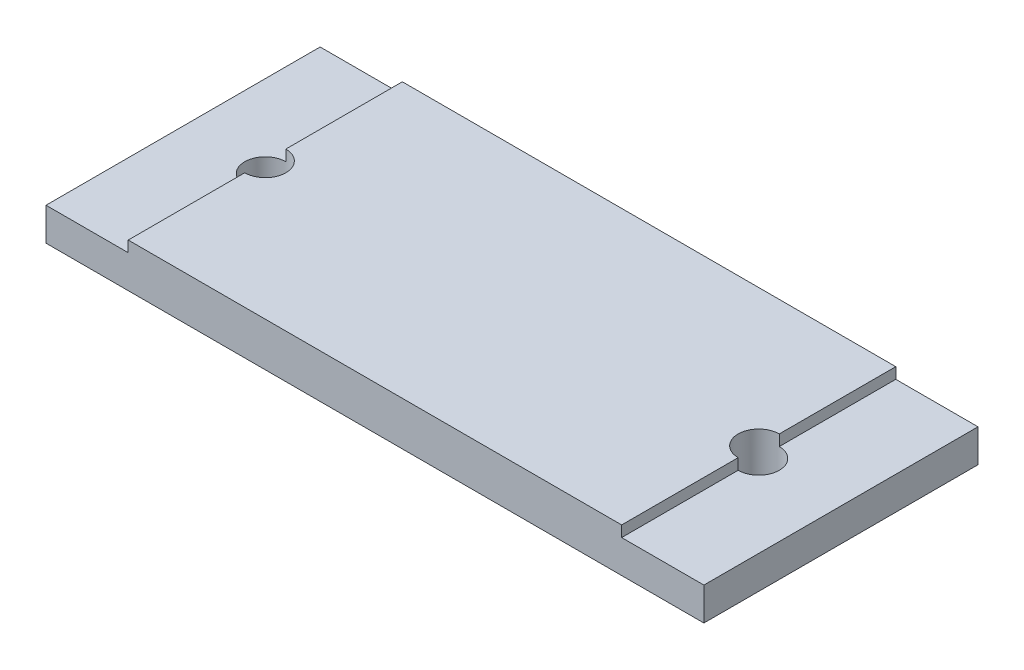
ISO-10303-21;
HEADER;
FILE_DESCRIPTION(('STEP AP214'),'2;1');
FILE_NAME('part.step','',(''),(''),'','','');
FILE_SCHEMA(('AUTOMOTIVE_DESIGN { 1 0 10303 214 1 1 1 1 }'));
ENDSEC;
DATA;
#1=APPLICATION_CONTEXT('core data for automotive mechanical design processes');
#2=APPLICATION_PROTOCOL_DEFINITION('international standard','automotive_design',2000,#1);
#3=PRODUCT_CONTEXT('',#1,'mechanical');
#4=PRODUCT('Part','Part','',(#3));
#5=PRODUCT_RELATED_PRODUCT_CATEGORY('part','',(#4));
#6=PRODUCT_DEFINITION_FORMATION('','',#4);
#7=PRODUCT_DEFINITION_CONTEXT('part definition',#1,'design');
#8=PRODUCT_DEFINITION('design','',#6,#7);
#9=PRODUCT_DEFINITION_SHAPE('','',#8);
#10=(LENGTH_UNIT() NAMED_UNIT(*) SI_UNIT(.MILLI.,.METRE.));
#11=(NAMED_UNIT(*) PLANE_ANGLE_UNIT() SI_UNIT($,.RADIAN.));
#12=(NAMED_UNIT(*) SI_UNIT($,.STERADIAN.) SOLID_ANGLE_UNIT());
#13=UNCERTAINTY_MEASURE_WITH_UNIT(LENGTH_MEASURE(1.E-05),#10,'distance_accuracy_value','');
#14=(GEOMETRIC_REPRESENTATION_CONTEXT(3) GLOBAL_UNCERTAINTY_ASSIGNED_CONTEXT((#13)) GLOBAL_UNIT_ASSIGNED_CONTEXT((#10,
#11,#12)) REPRESENTATION_CONTEXT('',''));
#15=CARTESIAN_POINT('',(0.,0.,0.));
#16=DIRECTION('',(0.,0.,1.));
#17=DIRECTION('',(1.,0.,0.));
#18=AXIS2_PLACEMENT_3D('',#15,#16,#17);
#19=CARTESIAN_POINT('',(0.,15.24,0.));
#20=DIRECTION('',(0.,1.,0.));
#21=DIRECTION('',(0.,0.,1.));
#22=AXIS2_PLACEMENT_3D('',#19,#20,#21);
#23=PLANE('',#22);
#24=DIRECTION('',(0.,0.,1.));
#25=VECTOR('',#24,1.);
#26=CARTESIAN_POINT('',(38.1,15.24,0.));
#27=LINE('',#26,#25);
#28=CARTESIAN_POINT('',(38.1,15.24,0.));
#29=VERTEX_POINT('',#28);
#30=CARTESIAN_POINT('',(38.1,15.24,53.975));
#31=VERTEX_POINT('',#30);
#32=EDGE_CURVE('E163',#29,#31,#27,.T.);
#33=ORIENTED_EDGE('',*,*,#32,.F.);
#34=DIRECTION('',(-1.,0.,0.));
#35=VECTOR('',#34,1.);
#36=CARTESIAN_POINT('',(0.,15.24,0.));
#37=LINE('',#36,#35);
#38=CARTESIAN_POINT('',(0.,15.24,0.));
#39=VERTEX_POINT('',#38);
#40=EDGE_CURVE('E198',#29,#39,#37,.T.);
#41=ORIENTED_EDGE('',*,*,#40,.T.);
#42=DIRECTION('',(0.,0.,1.));
#43=VECTOR('',#42,1.);
#44=CARTESIAN_POINT('',(0.,15.24,0.));
#45=LINE('',#44,#43);
#46=CARTESIAN_POINT('',(0.,15.24,127.));
#47=VERTEX_POINT('',#46);
#48=EDGE_CURVE('E186',#39,#47,#45,.T.);
#49=ORIENTED_EDGE('',*,*,#48,.T.);
#50=DIRECTION('',(1.,0.,0.));
#51=VECTOR('',#50,1.);
#52=CARTESIAN_POINT('',(0.,15.24,127.));
#53=LINE('',#52,#51);
#54=CARTESIAN_POINT('',(38.1,15.24,127.));
#55=VERTEX_POINT('',#54);
#56=EDGE_CURVE('E192',#47,#55,#53,.T.);
#57=ORIENTED_EDGE('',*,*,#56,.T.);
#58=DIRECTION('',(0.,0.,1.));
#59=VECTOR('',#58,1.);
#60=CARTESIAN_POINT('',(38.1,15.24,73.025));
#61=LINE('',#60,#59);
#62=CARTESIAN_POINT('',(38.1,15.24,73.025));
#63=VERTEX_POINT('',#62);
#64=EDGE_CURVE('E299',#63,#55,#61,.T.);
#65=ORIENTED_EDGE('',*,*,#64,.F.);
#66=CARTESIAN_POINT('',(38.1,15.24,63.5));
#67=DIRECTION('',(0.,1.,0.));
#68=DIRECTION('',(0.,0.,1.));
#69=AXIS2_PLACEMENT_3D('',#66,#67,#68);
#70=CIRCLE('',#69,9.525);
#71=EDGE_CURVE('E179',#31,#63,#70,.T.);
#72=ORIENTED_EDGE('',*,*,#71,.F.);
#73=EDGE_LOOP('',(#33,#41,#49,#57,#65,#72));
#74=FACE_BOUND('',#73,.T.);
#75=ADVANCED_FACE('F49',(#74),#23,.T.);
#76=DIRECTION('',(0.,0.,-1.));
#77=VECTOR('',#76,1.);
#78=CARTESIAN_POINT('',(266.7,15.24,0.));
#79=LINE('',#78,#77);
#80=CARTESIAN_POINT('',(266.7,15.24,53.975));
#81=VERTEX_POINT('',#80);
#82=CARTESIAN_POINT('',(266.7,15.24,0.));
#83=VERTEX_POINT('',#82);
#84=EDGE_CURVE('E65',#81,#83,#79,.T.);
#85=ORIENTED_EDGE('',*,*,#84,.F.);
#86=CARTESIAN_POINT('',(266.7,15.24,63.5));
#87=DIRECTION('',(0.,1.,0.));
#88=DIRECTION('',(0.,0.,1.));
#89=AXIS2_PLACEMENT_3D('',#86,#87,#88);
#90=CIRCLE('',#89,9.52500000000002);
#91=CARTESIAN_POINT('',(266.7,15.24,73.025));
#92=VERTEX_POINT('',#91);
#93=EDGE_CURVE('E69',#92,#81,#90,.T.);
#94=ORIENTED_EDGE('',*,*,#93,.F.);
#95=DIRECTION('',(0.,0.,-1.));
#96=VECTOR('',#95,1.);
#97=CARTESIAN_POINT('',(266.7,15.24,73.025));
#98=LINE('',#97,#96);
#99=CARTESIAN_POINT('',(266.7,15.24,127.));
#100=VERTEX_POINT('',#99);
#101=EDGE_CURVE('E263',#100,#92,#98,.T.);
#102=ORIENTED_EDGE('',*,*,#101,.F.);
#103=CARTESIAN_POINT('',(304.8,15.24,127.));
#104=VERTEX_POINT('',#103);
#105=EDGE_CURVE('E190',#100,#104,#53,.T.);
#106=ORIENTED_EDGE('',*,*,#105,.T.);
#107=DIRECTION('',(0.,0.,-1.));
#108=VECTOR('',#107,1.);
#109=CARTESIAN_POINT('',(304.8,15.24,0.));
#110=LINE('',#109,#108);
#111=CARTESIAN_POINT('',(304.8,15.24,0.));
#112=VERTEX_POINT('',#111);
#113=EDGE_CURVE('E195',#104,#112,#110,.T.);
#114=ORIENTED_EDGE('',*,*,#113,.T.);
#115=EDGE_CURVE('E199',#112,#83,#37,.T.);
#116=ORIENTED_EDGE('',*,*,#115,.T.);
#117=EDGE_LOOP('',(#85,#94,#102,#106,#114,#116));
#118=FACE_BOUND('',#117,.T.);
#119=ADVANCED_FACE('F262',(#118),#23,.T.);
#120=CARTESIAN_POINT('',(0.,0.,0.));
#121=DIRECTION('',(0.,1.,0.));
#122=DIRECTION('',(0.,0.,1.));
#123=AXIS2_PLACEMENT_3D('',#120,#121,#122);
#124=PLANE('',#123);
#125=DIRECTION('',(0.,0.,1.));
#126=VECTOR('',#125,1.);
#127=CARTESIAN_POINT('',(0.,0.,0.));
#128=LINE('',#127,#126);
#129=CARTESIAN_POINT('',(0.,0.,0.));
#130=VERTEX_POINT('',#129);
#131=CARTESIAN_POINT('',(0.,0.,127.));
#132=VERTEX_POINT('',#131);
#133=EDGE_CURVE('E182',#130,#132,#128,.T.);
#134=ORIENTED_EDGE('',*,*,#133,.F.);
#135=DIRECTION('',(-1.,0.,0.));
#136=VECTOR('',#135,1.);
#137=CARTESIAN_POINT('',(0.,0.,0.));
#138=LINE('',#137,#136);
#139=CARTESIAN_POINT('',(304.8,0.,0.));
#140=VERTEX_POINT('',#139);
#141=EDGE_CURVE('E191',#140,#130,#138,.T.);
#142=ORIENTED_EDGE('',*,*,#141,.F.);
#143=DIRECTION('',(0.,0.,-1.));
#144=VECTOR('',#143,1.);
#145=CARTESIAN_POINT('',(304.8,0.,0.));
#146=LINE('',#145,#144);
#147=CARTESIAN_POINT('',(304.8,0.,127.));
#148=VERTEX_POINT('',#147);
#149=EDGE_CURVE('E209',#148,#140,#146,.T.);
#150=ORIENTED_EDGE('',*,*,#149,.F.);
#151=DIRECTION('',(1.,0.,0.));
#152=VECTOR('',#151,1.);
#153=CARTESIAN_POINT('',(0.,0.,127.));
#154=LINE('',#153,#152);
#155=EDGE_CURVE('E206',#132,#148,#154,.T.);
#156=ORIENTED_EDGE('',*,*,#155,.F.);
#157=EDGE_LOOP('',(#134,#142,#150,#156));
#158=FACE_BOUND('',#157,.T.);
#159=CARTESIAN_POINT('',(38.1,0.,63.5));
#160=DIRECTION('',(0.,1.,0.));
#161=DIRECTION('',(0.,0.,1.));
#162=AXIS2_PLACEMENT_3D('',#159,#160,#161);
#163=CIRCLE('',#162,9.525);
#164=CARTESIAN_POINT('',(38.1,0.,73.025));
#165=VERTEX_POINT('',#164);
#166=EDGE_CURVE('E177',#165,#165,#163,.T.);
#167=ORIENTED_EDGE('',*,*,#166,.T.);
#168=EDGE_LOOP('',(#167));
#169=FACE_BOUND('',#168,.T.);
#170=CARTESIAN_POINT('',(266.7,0.,63.5));
#171=DIRECTION('',(0.,1.,0.));
#172=DIRECTION('',(0.,0.,1.));
#173=AXIS2_PLACEMENT_3D('',#170,#171,#172);
#174=CIRCLE('',#173,9.52500000000002);
#175=CARTESIAN_POINT('',(266.7,0.,73.025));
#176=VERTEX_POINT('',#175);
#177=EDGE_CURVE('E165',#176,#176,#174,.T.);
#178=ORIENTED_EDGE('',*,*,#177,.T.);
#179=EDGE_LOOP('',(#178));
#180=FACE_BOUND('',#179,.T.);
#181=ADVANCED_FACE('F234',(#158,#169,#180),#124,.F.);
#182=CARTESIAN_POINT('',(0.,15.24,0.));
#183=DIRECTION('',(1.,0.,0.));
#184=DIRECTION('',(0.,0.,-1.));
#185=AXIS2_PLACEMENT_3D('',#182,#183,#184);
#186=PLANE('',#185);
#187=ORIENTED_EDGE('',*,*,#133,.T.);
#188=DIRECTION('',(0.,-1.,0.));
#189=VECTOR('',#188,1.);
#190=CARTESIAN_POINT('',(0.,15.24,127.));
#191=LINE('',#190,#189);
#192=EDGE_CURVE('E11',#47,#132,#191,.T.);
#193=ORIENTED_EDGE('',*,*,#192,.F.);
#194=ORIENTED_EDGE('',*,*,#48,.F.);
#195=DIRECTION('',(0.,-1.,0.));
#196=VECTOR('',#195,1.);
#197=CARTESIAN_POINT('',(0.,15.24,0.));
#198=LINE('',#197,#196);
#199=EDGE_CURVE('E202',#39,#130,#198,.T.);
#200=ORIENTED_EDGE('',*,*,#199,.T.);
#201=EDGE_LOOP('',(#187,#193,#194,#200));
#202=FACE_BOUND('',#201,.T.);
#203=ADVANCED_FACE('F51',(#202),#186,.F.);
#204=CARTESIAN_POINT('',(0.,15.24,127.));
#205=DIRECTION('',(0.,0.,-1.));
#206=DIRECTION('',(-1.,0.,0.));
#207=AXIS2_PLACEMENT_3D('',#204,#205,#206);
#208=PLANE('',#207);
#209=ORIENTED_EDGE('',*,*,#155,.T.);
#210=DIRECTION('',(0.,-1.,0.));
#211=VECTOR('',#210,1.);
#212=CARTESIAN_POINT('',(304.8,15.24,127.));
#213=LINE('',#212,#211);
#214=EDGE_CURVE('E58',#104,#148,#213,.T.);
#215=ORIENTED_EDGE('',*,*,#214,.F.);
#216=ORIENTED_EDGE('',*,*,#105,.F.);
#217=DIRECTION('',(0.,-1.,0.));
#218=VECTOR('',#217,1.);
#219=CARTESIAN_POINT('',(266.7,20.32,127.));
#220=LINE('',#219,#218);
#221=CARTESIAN_POINT('',(266.7,20.32,127.));
#222=VERTEX_POINT('',#221);
#223=EDGE_CURVE('E268',#222,#100,#220,.T.);
#224=ORIENTED_EDGE('',*,*,#223,.F.);
#225=DIRECTION('',(1.,0.,0.));
#226=VECTOR('',#225,1.);
#227=CARTESIAN_POINT('',(38.1,20.32,127.));
#228=LINE('',#227,#226);
#229=CARTESIAN_POINT('',(38.1,20.32,127.));
#230=VERTEX_POINT('',#229);
#231=EDGE_CURVE('E314',#230,#222,#228,.T.);
#232=ORIENTED_EDGE('',*,*,#231,.F.);
#233=DIRECTION('',(0.,-1.,0.));
#234=VECTOR('',#233,1.);
#235=CARTESIAN_POINT('',(38.1,20.32,127.));
#236=LINE('',#235,#234);
#237=EDGE_CURVE('E172',#230,#55,#236,.T.);
#238=ORIENTED_EDGE('',*,*,#237,.T.);
#239=ORIENTED_EDGE('',*,*,#56,.F.);
#240=ORIENTED_EDGE('',*,*,#192,.T.);
#241=EDGE_LOOP('',(#209,#215,#216,#224,#232,#238,#239,#240));
#242=FACE_BOUND('',#241,.T.);
#243=ADVANCED_FACE('F266',(#242),#208,.F.);
#244=CARTESIAN_POINT('',(304.8,15.24,0.));
#245=DIRECTION('',(-1.,0.,0.));
#246=DIRECTION('',(0.,0.,1.));
#247=AXIS2_PLACEMENT_3D('',#244,#245,#246);
#248=PLANE('',#247);
#249=ORIENTED_EDGE('',*,*,#149,.T.);
#250=DIRECTION('',(0.,-1.,0.));
#251=VECTOR('',#250,1.);
#252=CARTESIAN_POINT('',(304.8,15.24,0.));
#253=LINE('',#252,#251);
#254=EDGE_CURVE('E217',#112,#140,#253,.T.);
#255=ORIENTED_EDGE('',*,*,#254,.F.);
#256=ORIENTED_EDGE('',*,*,#113,.F.);
#257=ORIENTED_EDGE('',*,*,#214,.T.);
#258=EDGE_LOOP('',(#249,#255,#256,#257));
#259=FACE_BOUND('',#258,.T.);
#260=ADVANCED_FACE('F227',(#259),#248,.F.);
#261=CARTESIAN_POINT('',(0.,15.24,0.));
#262=DIRECTION('',(0.,0.,1.));
#263=DIRECTION('',(1.,0.,0.));
#264=AXIS2_PLACEMENT_3D('',#261,#262,#263);
#265=PLANE('',#264);
#266=ORIENTED_EDGE('',*,*,#141,.T.);
#267=ORIENTED_EDGE('',*,*,#199,.F.);
#268=ORIENTED_EDGE('',*,*,#40,.F.);
#269=DIRECTION('',(0.,-1.,0.));
#270=VECTOR('',#269,1.);
#271=CARTESIAN_POINT('',(38.1,20.32,0.));
#272=LINE('',#271,#270);
#273=CARTESIAN_POINT('',(38.1,20.32,0.));
#274=VERTEX_POINT('',#273);
#275=EDGE_CURVE('E292',#274,#29,#272,.T.);
#276=ORIENTED_EDGE('',*,*,#275,.F.);
#277=DIRECTION('',(-1.,0.,0.));
#278=VECTOR('',#277,1.);
#279=CARTESIAN_POINT('',(38.1,20.32,0.));
#280=LINE('',#279,#278);
#281=CARTESIAN_POINT('',(266.7,20.32,0.));
#282=VERTEX_POINT('',#281);
#283=EDGE_CURVE('E156',#282,#274,#280,.T.);
#284=ORIENTED_EDGE('',*,*,#283,.F.);
#285=DIRECTION('',(0.,-1.,0.));
#286=VECTOR('',#285,1.);
#287=CARTESIAN_POINT('',(266.7,20.32,0.));
#288=LINE('',#287,#286);
#289=EDGE_CURVE('E288',#282,#83,#288,.T.);
#290=ORIENTED_EDGE('',*,*,#289,.T.);
#291=ORIENTED_EDGE('',*,*,#115,.F.);
#292=ORIENTED_EDGE('',*,*,#254,.T.);
#293=EDGE_LOOP('',(#266,#267,#268,#276,#284,#290,#291,#292));
#294=FACE_BOUND('',#293,.T.);
#295=ADVANCED_FACE('F238',(#294),#265,.F.);
#296=CARTESIAN_POINT('',(38.1,15.24,63.5));
#297=DIRECTION('',(0.,-1.,0.));
#298=DIRECTION('',(0.,0.,-1.));
#299=AXIS2_PLACEMENT_3D('',#296,#297,#298);
#300=CYLINDRICAL_SURFACE('',#299,9.525);
#301=ORIENTED_EDGE('',*,*,#71,.T.);
#302=DIRECTION('',(0.,-1.,0.));
#303=VECTOR('',#302,1.);
#304=CARTESIAN_POINT('',(38.1,20.32,73.025));
#305=LINE('',#304,#303);
#306=CARTESIAN_POINT('',(38.1,20.32,73.025));
#307=VERTEX_POINT('',#306);
#308=EDGE_CURVE('E146',#307,#63,#305,.T.);
#309=ORIENTED_EDGE('',*,*,#308,.F.);
#310=CARTESIAN_POINT('',(38.1,20.32,63.5));
#311=DIRECTION('',(0.,-1.,0.));
#312=DIRECTION('',(0.,0.,1.));
#313=AXIS2_PLACEMENT_3D('',#310,#311,#312);
#314=CIRCLE('',#313,9.52500000000001);
#315=CARTESIAN_POINT('',(38.1,20.32,53.975));
#316=VERTEX_POINT('',#315);
#317=EDGE_CURVE('E137',#316,#307,#314,.T.);
#318=ORIENTED_EDGE('',*,*,#317,.F.);
#319=DIRECTION('',(0.,-1.,0.));
#320=VECTOR('',#319,1.);
#321=CARTESIAN_POINT('',(38.1,20.32,53.975));
#322=LINE('',#321,#320);
#323=EDGE_CURVE('E143',#316,#31,#322,.T.);
#324=ORIENTED_EDGE('',*,*,#323,.T.);
#325=EDGE_LOOP('',(#301,#309,#318,#324));
#326=FACE_BOUND('',#325,.T.);
#327=ORIENTED_EDGE('',*,*,#166,.F.);
#328=EDGE_LOOP('',(#327));
#329=FACE_BOUND('',#328,.T.);
#330=ADVANCED_FACE('F140',(#326,#329),#300,.F.);
#331=CARTESIAN_POINT('',(266.7,15.24,63.5));
#332=DIRECTION('',(0.,-1.,0.));
#333=DIRECTION('',(0.,0.,-1.));
#334=AXIS2_PLACEMENT_3D('',#331,#332,#333);
#335=CYLINDRICAL_SURFACE('',#334,9.52500000000002);
#336=ORIENTED_EDGE('',*,*,#93,.T.);
#337=DIRECTION('',(0.,-1.,0.));
#338=VECTOR('',#337,1.);
#339=CARTESIAN_POINT('',(266.7,20.32,53.975));
#340=LINE('',#339,#338);
#341=CARTESIAN_POINT('',(266.7,20.32,53.975));
#342=VERTEX_POINT('',#341);
#343=EDGE_CURVE('E282',#342,#81,#340,.T.);
#344=ORIENTED_EDGE('',*,*,#343,.F.);
#345=CARTESIAN_POINT('',(266.7,20.32,63.5));
#346=DIRECTION('',(0.,-1.,0.));
#347=DIRECTION('',(0.,0.,1.));
#348=AXIS2_PLACEMENT_3D('',#345,#346,#347);
#349=CIRCLE('',#348,9.52500000000002);
#350=CARTESIAN_POINT('',(266.7,20.32,73.025));
#351=VERTEX_POINT('',#350);
#352=EDGE_CURVE('E309',#351,#342,#349,.T.);
#353=ORIENTED_EDGE('',*,*,#352,.F.);
#354=DIRECTION('',(0.,-1.,0.));
#355=VECTOR('',#354,1.);
#356=CARTESIAN_POINT('',(266.7,20.32,73.025));
#357=LINE('',#356,#355);
#358=EDGE_CURVE('E276',#351,#92,#357,.T.);
#359=ORIENTED_EDGE('',*,*,#358,.T.);
#360=EDGE_LOOP('',(#336,#344,#353,#359));
#361=FACE_BOUND('',#360,.T.);
#362=ORIENTED_EDGE('',*,*,#177,.F.);
#363=EDGE_LOOP('',(#362));
#364=FACE_BOUND('',#363,.T.);
#365=ADVANCED_FACE('F330',(#361,#364),#335,.F.);
#366=CARTESIAN_POINT('',(38.1,20.32,0.));
#367=DIRECTION('',(1.,0.,0.));
#368=DIRECTION('',(0.,0.,-1.));
#369=AXIS2_PLACEMENT_3D('',#366,#367,#368);
#370=PLANE('',#369);
#371=ORIENTED_EDGE('',*,*,#32,.T.);
#372=ORIENTED_EDGE('',*,*,#323,.F.);
#373=DIRECTION('',(0.,0.,1.));
#374=VECTOR('',#373,1.);
#375=CARTESIAN_POINT('',(38.1,20.32,0.));
#376=LINE('',#375,#374);
#377=EDGE_CURVE('E151',#274,#316,#376,.T.);
#378=ORIENTED_EDGE('',*,*,#377,.F.);
#379=ORIENTED_EDGE('',*,*,#275,.T.);
#380=EDGE_LOOP('',(#371,#372,#378,#379));
#381=FACE_BOUND('',#380,.T.);
#382=ADVANCED_FACE('F162',(#381),#370,.F.);
#383=CARTESIAN_POINT('',(38.1,20.32,73.025));
#384=DIRECTION('',(1.,0.,0.));
#385=DIRECTION('',(0.,0.,-1.));
#386=AXIS2_PLACEMENT_3D('',#383,#384,#385);
#387=PLANE('',#386);
#388=ORIENTED_EDGE('',*,*,#64,.T.);
#389=ORIENTED_EDGE('',*,*,#237,.F.);
#390=DIRECTION('',(0.,0.,1.));
#391=VECTOR('',#390,1.);
#392=CARTESIAN_POINT('',(38.1,20.32,73.025));
#393=LINE('',#392,#391);
#394=EDGE_CURVE('E150',#307,#230,#393,.T.);
#395=ORIENTED_EDGE('',*,*,#394,.F.);
#396=ORIENTED_EDGE('',*,*,#308,.T.);
#397=EDGE_LOOP('',(#388,#389,#395,#396));
#398=FACE_BOUND('',#397,.T.);
#399=ADVANCED_FACE('F321',(#398),#387,.F.);
#400=CARTESIAN_POINT('',(266.7,20.32,73.025));
#401=DIRECTION('',(-1.,0.,0.));
#402=DIRECTION('',(0.,0.,1.));
#403=AXIS2_PLACEMENT_3D('',#400,#401,#402);
#404=PLANE('',#403);
#405=ORIENTED_EDGE('',*,*,#101,.T.);
#406=ORIENTED_EDGE('',*,*,#358,.F.);
#407=DIRECTION('',(0.,0.,-1.));
#408=VECTOR('',#407,1.);
#409=CARTESIAN_POINT('',(266.7,20.32,73.025));
#410=LINE('',#409,#408);
#411=EDGE_CURVE('E274',#222,#351,#410,.T.);
#412=ORIENTED_EDGE('',*,*,#411,.F.);
#413=ORIENTED_EDGE('',*,*,#223,.T.);
#414=EDGE_LOOP('',(#405,#406,#412,#413));
#415=FACE_BOUND('',#414,.T.);
#416=ADVANCED_FACE('F271',(#415),#404,.F.);
#417=CARTESIAN_POINT('',(266.7,20.32,0.));
#418=DIRECTION('',(-1.,0.,0.));
#419=DIRECTION('',(0.,0.,1.));
#420=AXIS2_PLACEMENT_3D('',#417,#418,#419);
#421=PLANE('',#420);
#422=ORIENTED_EDGE('',*,*,#84,.T.);
#423=ORIENTED_EDGE('',*,*,#289,.F.);
#424=DIRECTION('',(0.,0.,-1.));
#425=VECTOR('',#424,1.);
#426=CARTESIAN_POINT('',(266.7,20.32,0.));
#427=LINE('',#426,#425);
#428=EDGE_CURVE('E306',#342,#282,#427,.T.);
#429=ORIENTED_EDGE('',*,*,#428,.F.);
#430=ORIENTED_EDGE('',*,*,#343,.T.);
#431=EDGE_LOOP('',(#422,#423,#429,#430));
#432=FACE_BOUND('',#431,.T.);
#433=ADVANCED_FACE('F328',(#432),#421,.F.);
#434=CARTESIAN_POINT('',(38.1,20.32,63.5));
#435=DIRECTION('',(0.,1.,0.));
#436=DIRECTION('',(0.,0.,1.));
#437=AXIS2_PLACEMENT_3D('',#434,#435,#436);
#438=PLANE('',#437);
#439=ORIENTED_EDGE('',*,*,#377,.T.);
#440=ORIENTED_EDGE('',*,*,#317,.T.);
#441=ORIENTED_EDGE('',*,*,#394,.T.);
#442=ORIENTED_EDGE('',*,*,#231,.T.);
#443=ORIENTED_EDGE('',*,*,#411,.T.);
#444=ORIENTED_EDGE('',*,*,#352,.T.);
#445=ORIENTED_EDGE('',*,*,#428,.T.);
#446=ORIENTED_EDGE('',*,*,#283,.T.);
#447=EDGE_LOOP('',(#439,#440,#441,#442,#443,#444,#445,#446));
#448=FACE_BOUND('',#447,.T.);
#449=ADVANCED_FACE('F154',(#448),#438,.T.);
#450=CLOSED_SHELL('',(#75,#119,#181,#203,#243,#260,#295,#330,#365,#382,#399,#416,#433,#449));
#451=MANIFOLD_SOLID_BREP('B2',#450);
#452=ADVANCED_BREP_SHAPE_REPRESENTATION('',(#18,#451),#14);
#453=SHAPE_DEFINITION_REPRESENTATION(#9,#452);
ENDSEC;
END-ISO-10303-21;
